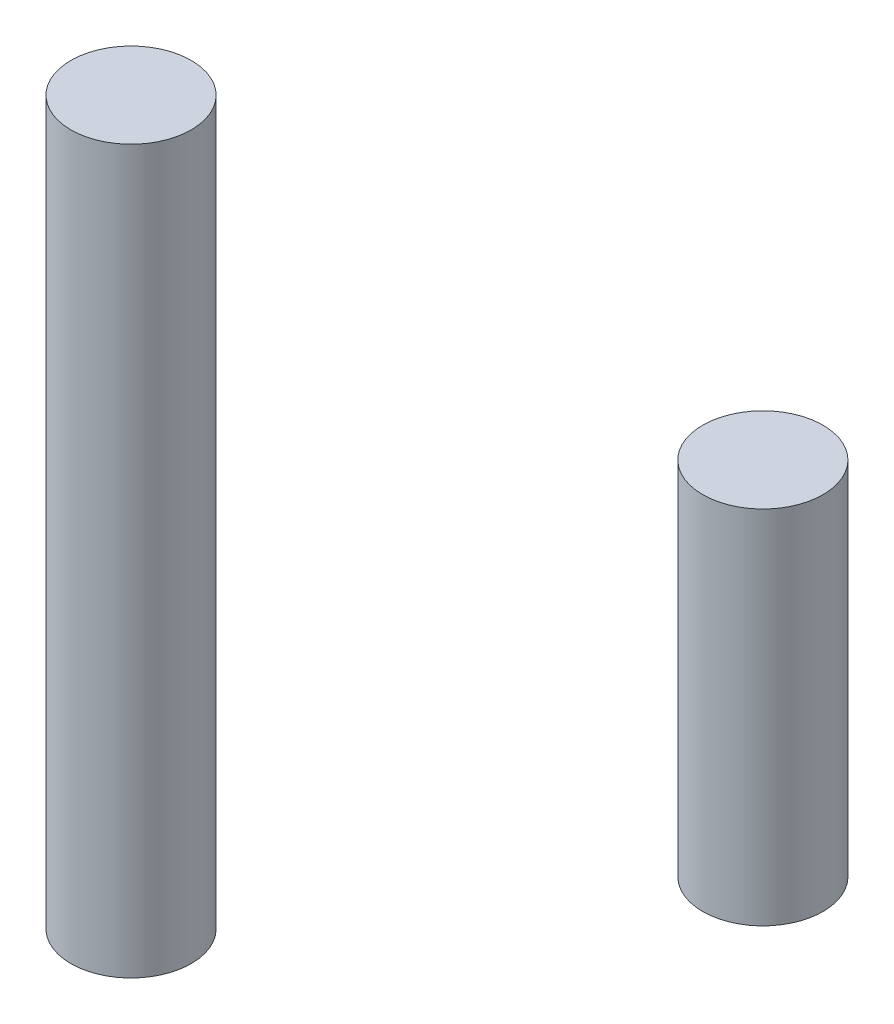
ISO-10303-21;
HEADER;
FILE_DESCRIPTION(('STEP AP214'),'2;1');
FILE_NAME('part.step','',(''),(''),'','','');
FILE_SCHEMA(('AUTOMOTIVE_DESIGN { 1 0 10303 214 1 1 1 1 }'));
ENDSEC;
DATA;
#1=APPLICATION_CONTEXT('core data for automotive mechanical design processes');
#2=APPLICATION_PROTOCOL_DEFINITION('international standard','automotive_design',2000,#1);
#3=PRODUCT_CONTEXT('',#1,'mechanical');
#4=PRODUCT('Part','Part','',(#3));
#5=PRODUCT_RELATED_PRODUCT_CATEGORY('part','',(#4));
#6=PRODUCT_DEFINITION_FORMATION('','',#4);
#7=PRODUCT_DEFINITION_CONTEXT('part definition',#1,'design');
#8=PRODUCT_DEFINITION('design','',#6,#7);
#9=PRODUCT_DEFINITION_SHAPE('','',#8);
#10=(LENGTH_UNIT() NAMED_UNIT(*) SI_UNIT(.MILLI.,.METRE.));
#11=(NAMED_UNIT(*) PLANE_ANGLE_UNIT() SI_UNIT($,.RADIAN.));
#12=(NAMED_UNIT(*) SI_UNIT($,.STERADIAN.) SOLID_ANGLE_UNIT());
#13=UNCERTAINTY_MEASURE_WITH_UNIT(LENGTH_MEASURE(1.E-05),#10,'distance_accuracy_value','');
#14=(GEOMETRIC_REPRESENTATION_CONTEXT(3) GLOBAL_UNCERTAINTY_ASSIGNED_CONTEXT((#13)) GLOBAL_UNIT_ASSIGNED_CONTEXT((#10,
#11,#12)) REPRESENTATION_CONTEXT('',''));
#15=CARTESIAN_POINT('',(0.,0.,0.));
#16=DIRECTION('',(0.,0.,1.));
#17=DIRECTION('',(1.,0.,0.));
#18=AXIS2_PLACEMENT_3D('',#15,#16,#17);
#19=CARTESIAN_POINT('',(10.5,-96.5,26.));
#20=DIRECTION('',(0.,-1.,0.));
#21=DIRECTION('',(0.,0.,-1.));
#22=AXIS2_PLACEMENT_3D('',#19,#20,#21);
#23=CYLINDRICAL_SURFACE('',#22,2.);
#24=CARTESIAN_POINT('',(10.5,-96.5,26.));
#25=DIRECTION('',(0.,1.,0.));
#26=DIRECTION('',(0.,0.,1.));
#27=AXIS2_PLACEMENT_3D('',#24,#25,#26);
#28=CIRCLE('',#27,2.);
#29=CARTESIAN_POINT('',(10.5,-96.5,28.));
#30=VERTEX_POINT('',#29);
#31=EDGE_CURVE('E11',#30,#30,#28,.T.);
#32=ORIENTED_EDGE('',*,*,#31,.F.);
#33=EDGE_LOOP('',(#32));
#34=FACE_BOUND('',#33,.T.);
#35=CARTESIAN_POINT('',(10.5,-108.5,26.));
#36=DIRECTION('',(0.,1.,0.));
#37=DIRECTION('',(0.,0.,1.));
#38=AXIS2_PLACEMENT_3D('',#35,#36,#37);
#39=CIRCLE('',#38,2.);
#40=CARTESIAN_POINT('',(10.5,-108.5,28.));
#41=VERTEX_POINT('',#40);
#42=EDGE_CURVE('E48',#41,#41,#39,.T.);
#43=ORIENTED_EDGE('',*,*,#42,.T.);
#44=EDGE_LOOP('',(#43));
#45=FACE_BOUND('',#44,.T.);
#46=ADVANCED_FACE('F45',(#34,#45),#23,.T.);
#47=CARTESIAN_POINT('',(10.5,-96.5,26.));
#48=DIRECTION('',(0.,1.,0.));
#49=DIRECTION('',(0.,0.,1.));
#50=AXIS2_PLACEMENT_3D('',#47,#48,#49);
#51=PLANE('',#50);
#52=ORIENTED_EDGE('',*,*,#31,.T.);
#53=EDGE_LOOP('',(#52));
#54=FACE_BOUND('',#53,.T.);
#55=ADVANCED_FACE('F60',(#54),#51,.T.);
#56=CARTESIAN_POINT('',(10.5,-108.5,26.));
#57=DIRECTION('',(0.,1.,0.));
#58=DIRECTION('',(0.,0.,1.));
#59=AXIS2_PLACEMENT_3D('',#56,#57,#58);
#60=PLANE('',#59);
#61=ORIENTED_EDGE('',*,*,#42,.F.);
#62=EDGE_LOOP('',(#61));
#63=FACE_BOUND('',#62,.T.);
#64=ADVANCED_FACE('F58',(#63),#60,.F.);
#65=CLOSED_SHELL('',(#46,#55,#64));
#66=MANIFOLD_SOLID_BREP('B2',#65);
#67=CARTESIAN_POINT('',(-10.5,-96.5,26.));
#68=DIRECTION('',(0.,-1.,0.));
#69=DIRECTION('',(0.,0.,-1.));
#70=AXIS2_PLACEMENT_3D('',#67,#68,#69);
#71=CYLINDRICAL_SURFACE('',#70,2.);
#72=CARTESIAN_POINT('',(-10.5,-96.5,26.));
#73=DIRECTION('',(0.,1.,0.));
#74=DIRECTION('',(0.,0.,1.));
#75=AXIS2_PLACEMENT_3D('',#72,#73,#74);
#76=CIRCLE('',#75,2.);
#77=CARTESIAN_POINT('',(-10.5,-96.5,28.));
#78=VERTEX_POINT('',#77);
#79=EDGE_CURVE('E44',#78,#78,#76,.T.);
#80=ORIENTED_EDGE('',*,*,#79,.F.);
#81=EDGE_LOOP('',(#80));
#82=FACE_BOUND('',#81,.T.);
#83=CARTESIAN_POINT('',(-10.5,-120.5,26.));
#84=DIRECTION('',(0.,1.,0.));
#85=DIRECTION('',(0.,0.,1.));
#86=AXIS2_PLACEMENT_3D('',#83,#84,#85);
#87=CIRCLE('',#86,2.);
#88=CARTESIAN_POINT('',(-10.5,-120.5,28.));
#89=VERTEX_POINT('',#88);
#90=EDGE_CURVE('E101',#89,#89,#87,.T.);
#91=ORIENTED_EDGE('',*,*,#90,.T.);
#92=EDGE_LOOP('',(#91));
#93=FACE_BOUND('',#92,.T.);
#94=ADVANCED_FACE('F98',(#82,#93),#71,.T.);
#95=CARTESIAN_POINT('',(-10.5,-96.5,26.));
#96=DIRECTION('',(0.,1.,0.));
#97=DIRECTION('',(0.,0.,1.));
#98=AXIS2_PLACEMENT_3D('',#95,#96,#97);
#99=PLANE('',#98);
#100=ORIENTED_EDGE('',*,*,#79,.T.);
#101=EDGE_LOOP('',(#100));
#102=FACE_BOUND('',#101,.T.);
#103=ADVANCED_FACE('F113',(#102),#99,.T.);
#104=CARTESIAN_POINT('',(-10.5,-120.5,26.));
#105=DIRECTION('',(0.,1.,0.));
#106=DIRECTION('',(0.,0.,1.));
#107=AXIS2_PLACEMENT_3D('',#104,#105,#106);
#108=PLANE('',#107);
#109=ORIENTED_EDGE('',*,*,#90,.F.);
#110=EDGE_LOOP('',(#109));
#111=FACE_BOUND('',#110,.T.);
#112=ADVANCED_FACE('F111',(#111),#108,.F.);
#113=CLOSED_SHELL('',(#94,#103,#112));
#114=MANIFOLD_SOLID_BREP('B6',#113);
#115=ADVANCED_BREP_SHAPE_REPRESENTATION('',(#18,#66,#114),#14);
#116=SHAPE_DEFINITION_REPRESENTATION(#9,#115);
ENDSEC;
END-ISO-10303-21;
